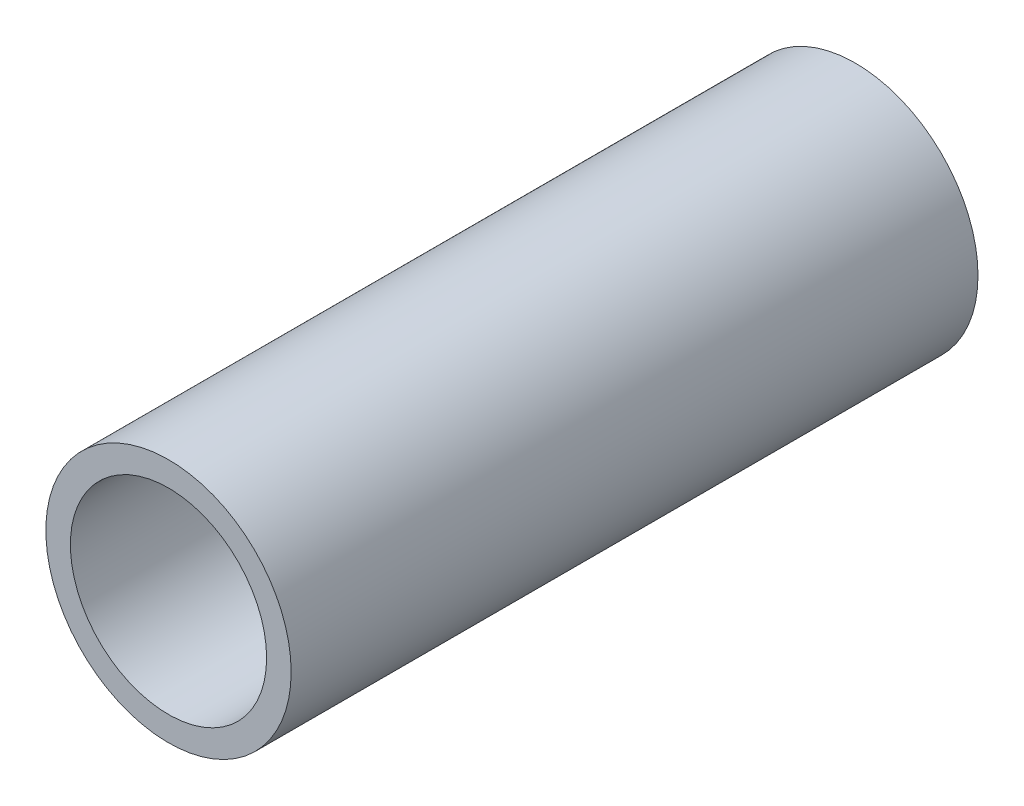
ISO-10303-21;
HEADER;
FILE_DESCRIPTION(('STEP AP214'),'2;1');
FILE_NAME('part.step','',(''),(''),'','','');
FILE_SCHEMA(('AUTOMOTIVE_DESIGN { 1 0 10303 214 1 1 1 1 }'));
ENDSEC;
DATA;
#1=APPLICATION_CONTEXT('core data for automotive mechanical design processes');
#2=APPLICATION_PROTOCOL_DEFINITION('international standard','automotive_design',2000,#1);
#3=PRODUCT_CONTEXT('',#1,'mechanical');
#4=PRODUCT('Part','Part','',(#3));
#5=PRODUCT_RELATED_PRODUCT_CATEGORY('part','',(#4));
#6=PRODUCT_DEFINITION_FORMATION('','',#4);
#7=PRODUCT_DEFINITION_CONTEXT('part definition',#1,'design');
#8=PRODUCT_DEFINITION('design','',#6,#7);
#9=PRODUCT_DEFINITION_SHAPE('','',#8);
#10=(LENGTH_UNIT() NAMED_UNIT(*) SI_UNIT(.MILLI.,.METRE.));
#11=(NAMED_UNIT(*) PLANE_ANGLE_UNIT() SI_UNIT($,.RADIAN.));
#12=(NAMED_UNIT(*) SI_UNIT($,.STERADIAN.) SOLID_ANGLE_UNIT());
#13=UNCERTAINTY_MEASURE_WITH_UNIT(LENGTH_MEASURE(1.E-05),#10,'distance_accuracy_value','');
#14=(GEOMETRIC_REPRESENTATION_CONTEXT(3) GLOBAL_UNCERTAINTY_ASSIGNED_CONTEXT((#13)) GLOBAL_UNIT_ASSIGNED_CONTEXT((#10,
#11,#12)) REPRESENTATION_CONTEXT('',''));
#15=CARTESIAN_POINT('',(0.,0.,0.));
#16=DIRECTION('',(0.,0.,1.));
#17=DIRECTION('',(1.,0.,0.));
#18=AXIS2_PLACEMENT_3D('',#15,#16,#17);
#19=CARTESIAN_POINT('',(0.,0.,280.));
#20=DIRECTION('',(0.,0.,-1.));
#21=DIRECTION('',(-1.,0.,0.));
#22=AXIS2_PLACEMENT_3D('',#19,#20,#21);
#23=CYLINDRICAL_SURFACE('',#22,50.);
#24=CARTESIAN_POINT('',(0.,0.,280.));
#25=DIRECTION('',(0.,0.,1.));
#26=DIRECTION('',(1.,0.,0.));
#27=AXIS2_PLACEMENT_3D('',#24,#25,#26);
#28=CIRCLE('',#27,50.);
#29=CARTESIAN_POINT('',(50.,0.,280.));
#30=VERTEX_POINT('',#29);
#31=EDGE_CURVE('E10',#30,#30,#28,.T.);
#32=ORIENTED_EDGE('',*,*,#31,.F.);
#33=EDGE_LOOP('',(#32));
#34=FACE_BOUND('',#33,.T.);
#35=CARTESIAN_POINT('',(0.,0.,0.));
#36=DIRECTION('',(0.,0.,1.));
#37=DIRECTION('',(1.,0.,0.));
#38=AXIS2_PLACEMENT_3D('',#35,#36,#37);
#39=CIRCLE('',#38,50.);
#40=CARTESIAN_POINT('',(50.,0.,0.));
#41=VERTEX_POINT('',#40);
#42=EDGE_CURVE('E40',#41,#41,#39,.T.);
#43=ORIENTED_EDGE('',*,*,#42,.T.);
#44=EDGE_LOOP('',(#43));
#45=FACE_BOUND('',#44,.T.);
#46=ADVANCED_FACE('F37',(#34,#45),#23,.T.);
#47=CARTESIAN_POINT('',(0.,0.,280.));
#48=DIRECTION('',(0.,0.,1.));
#49=DIRECTION('',(1.,0.,0.));
#50=AXIS2_PLACEMENT_3D('',#47,#48,#49);
#51=PLANE('',#50);
#52=CARTESIAN_POINT('',(0.,0.,280.));
#53=DIRECTION('',(0.,0.,1.));
#54=DIRECTION('',(1.,0.,0.));
#55=AXIS2_PLACEMENT_3D('',#52,#53,#54);
#56=CIRCLE('',#55,40.);
#57=CARTESIAN_POINT('',(40.,0.,280.));
#58=VERTEX_POINT('',#57);
#59=EDGE_CURVE('E47',#58,#58,#56,.T.);
#60=ORIENTED_EDGE('',*,*,#59,.F.);
#61=EDGE_LOOP('',(#60));
#62=FACE_BOUND('',#61,.T.);
#63=ORIENTED_EDGE('',*,*,#31,.T.);
#64=EDGE_LOOP('',(#63));
#65=FACE_BOUND('',#64,.T.);
#66=ADVANCED_FACE('F58',(#62,#65),#51,.T.);
#67=CARTESIAN_POINT('',(0.,0.,0.));
#68=DIRECTION('',(0.,0.,1.));
#69=DIRECTION('',(1.,0.,0.));
#70=AXIS2_PLACEMENT_3D('',#67,#68,#69);
#71=PLANE('',#70);
#72=CARTESIAN_POINT('',(0.,0.,0.));
#73=DIRECTION('',(0.,0.,1.));
#74=DIRECTION('',(1.,0.,0.));
#75=AXIS2_PLACEMENT_3D('',#72,#73,#74);
#76=CIRCLE('',#75,40.);
#77=CARTESIAN_POINT('',(40.,0.,0.));
#78=VERTEX_POINT('',#77);
#79=EDGE_CURVE('E49',#78,#78,#76,.T.);
#80=ORIENTED_EDGE('',*,*,#79,.T.);
#81=EDGE_LOOP('',(#80));
#82=FACE_BOUND('',#81,.T.);
#83=ORIENTED_EDGE('',*,*,#42,.F.);
#84=EDGE_LOOP('',(#83));
#85=FACE_BOUND('',#84,.T.);
#86=ADVANCED_FACE('F60',(#82,#85),#71,.F.);
#87=CARTESIAN_POINT('',(0.,0.,280.));
#88=DIRECTION('',(0.,0.,-1.));
#89=DIRECTION('',(-1.,0.,0.));
#90=AXIS2_PLACEMENT_3D('',#87,#88,#89);
#91=CYLINDRICAL_SURFACE('',#90,40.);
#92=ORIENTED_EDGE('',*,*,#59,.T.);
#93=EDGE_LOOP('',(#92));
#94=FACE_BOUND('',#93,.T.);
#95=ORIENTED_EDGE('',*,*,#79,.F.);
#96=EDGE_LOOP('',(#95));
#97=FACE_BOUND('',#96,.T.);
#98=ADVANCED_FACE('F55',(#94,#97),#91,.F.);
#99=CLOSED_SHELL('',(#46,#66,#86,#98));
#100=MANIFOLD_SOLID_BREP('B2',#99);
#101=ADVANCED_BREP_SHAPE_REPRESENTATION('',(#18,#100),#14);
#102=SHAPE_DEFINITION_REPRESENTATION(#9,#101);
ENDSEC;
END-ISO-10303-21;
